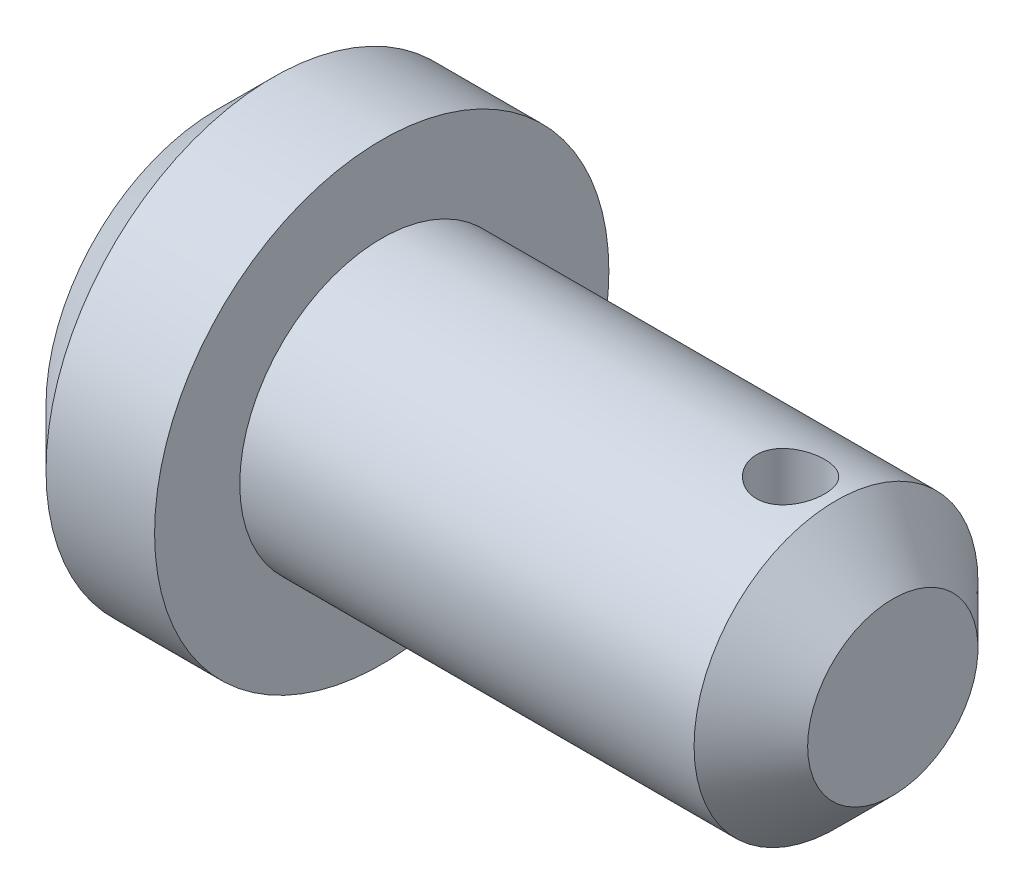
ISO-10303-21;
HEADER;
FILE_DESCRIPTION(('STEP AP214'),'2;1');
FILE_NAME('part.step','',(''),(''),'','','');
FILE_SCHEMA(('AUTOMOTIVE_DESIGN { 1 0 10303 214 1 1 1 1 }'));
ENDSEC;
DATA;
#1=APPLICATION_CONTEXT('core data for automotive mechanical design processes');
#2=APPLICATION_PROTOCOL_DEFINITION('international standard','automotive_design',2000,#1);
#3=PRODUCT_CONTEXT('',#1,'mechanical');
#4=PRODUCT('Part','Part','',(#3));
#5=PRODUCT_RELATED_PRODUCT_CATEGORY('part','',(#4));
#6=PRODUCT_DEFINITION_FORMATION('','',#4);
#7=PRODUCT_DEFINITION_CONTEXT('part definition',#1,'design');
#8=PRODUCT_DEFINITION('design','',#6,#7);
#9=PRODUCT_DEFINITION_SHAPE('','',#8);
#10=(LENGTH_UNIT() NAMED_UNIT(*) SI_UNIT(.MILLI.,.METRE.));
#11=(NAMED_UNIT(*) PLANE_ANGLE_UNIT() SI_UNIT($,.RADIAN.));
#12=(NAMED_UNIT(*) SI_UNIT($,.STERADIAN.) SOLID_ANGLE_UNIT());
#13=UNCERTAINTY_MEASURE_WITH_UNIT(LENGTH_MEASURE(1.E-05),#10,'distance_accuracy_value','');
#14=(GEOMETRIC_REPRESENTATION_CONTEXT(3) GLOBAL_UNCERTAINTY_ASSIGNED_CONTEXT((#13)) GLOBAL_UNIT_ASSIGNED_CONTEXT((#10,
#11,#12)) REPRESENTATION_CONTEXT('',''));
#15=CARTESIAN_POINT('',(0.,0.,0.));
#16=DIRECTION('',(0.,0.,1.));
#17=DIRECTION('',(1.,0.,0.));
#18=AXIS2_PLACEMENT_3D('',#15,#16,#17);
#19=CARTESIAN_POINT('',(90.,0.,-15.));
#20=DIRECTION('',(-1.,0.,0.));
#21=DIRECTION('',(0.,0.,1.));
#22=AXIS2_PLACEMENT_3D('',#19,#20,#21);
#23=PLANE('',#22);
#24=CARTESIAN_POINT('',(90.,0.,0.));
#25=DIRECTION('',(-1.,0.,0.));
#26=DIRECTION('',(0.,0.,1.));
#27=AXIS2_PLACEMENT_3D('',#24,#25,#26);
#28=CIRCLE('',#27,15.);
#29=CARTESIAN_POINT('',(90.,0.,15.));
#30=VERTEX_POINT('',#29);
#31=EDGE_CURVE('E10',#30,#30,#28,.T.);
#32=ORIENTED_EDGE('',*,*,#31,.F.);
#33=EDGE_LOOP('',(#32));
#34=FACE_BOUND('',#33,.T.);
#35=ADVANCED_FACE('F31',(#34),#23,.F.);
#36=CARTESIAN_POINT('',(90.,0.,0.));
#37=DIRECTION('',(-1.,0.,0.));
#38=DIRECTION('',(0.,0.,1.));
#39=AXIS2_PLACEMENT_3D('',#36,#37,#38);
#40=CONICAL_SURFACE('',#39,15.,0.78539816339745);
#41=CARTESIAN_POINT('',(80.,0.,0.));
#42=DIRECTION('',(-1.,0.,0.));
#43=DIRECTION('',(0.,0.,1.));
#44=AXIS2_PLACEMENT_3D('',#41,#42,#43);
#45=CIRCLE('',#44,25.);
#46=CARTESIAN_POINT('',(80.,0.,25.));
#47=VERTEX_POINT('',#46);
#48=EDGE_CURVE('E43',#47,#47,#45,.T.);
#49=ORIENTED_EDGE('',*,*,#48,.F.);
#50=EDGE_LOOP('',(#49));
#51=FACE_BOUND('',#50,.T.);
#52=ORIENTED_EDGE('',*,*,#31,.T.);
#53=EDGE_LOOP('',(#52));
#54=FACE_BOUND('',#53,.T.);
#55=ADVANCED_FACE('F82',(#51,#54),#40,.T.);
#56=CARTESIAN_POINT('',(0.,0.,0.));
#57=DIRECTION('',(-1.,0.,0.));
#58=DIRECTION('',(0.,0.,1.));
#59=AXIS2_PLACEMENT_3D('',#56,#57,#58);
#60=CYLINDRICAL_SURFACE('',#59,25.);
#61=CARTESIAN_POINT('',(72.,-24.2693221990232,6.));
#62=CARTESIAN_POINT('',(72.1659402675794,-24.2693192173439,6.00000460058749));
#63=CARTESIAN_POINT('',(72.3318290721376,-24.2710270328907,5.99311472313627));
#64=CARTESIAN_POINT('',(72.6624452022316,-24.2777997433194,5.96562344868169));
#65=CARTESIAN_POINT('',(72.8271723780411,-24.2828650632483,5.94502031563237));
#66=CARTESIAN_POINT('',(73.1542790051947,-24.2962060432289,5.89025958920488));
#67=CARTESIAN_POINT('',(73.316657577368,-24.304482874777,5.85609704951731));
#68=CARTESIAN_POINT('',(73.6379223232941,-24.324002012079,5.77448580831014));
#69=CARTESIAN_POINT('',(73.796807183095,-24.3352454135442,5.72703219729494));
#70=CARTESIAN_POINT('',(74.1096655326971,-24.3603450339749,5.61930954739399));
#71=CARTESIAN_POINT('',(74.2636465617872,-24.3741969907612,5.55906139358703));
#72=CARTESIAN_POINT('',(74.5659889469169,-24.4041320001377,5.42613868912028));
#73=CARTESIAN_POINT('',(74.7143482023366,-24.420215876438,5.35345954837853));
#74=CARTESIAN_POINT('',(75.0043616384202,-24.4541500249133,5.19624934621714));
#75=CARTESIAN_POINT('',(75.1460183038256,-24.471999634801,5.11172272360157));
#76=CARTESIAN_POINT('',(75.4218305512816,-24.5089827826595,4.93135257338601));
#77=CARTESIAN_POINT('',(75.5559832886854,-24.5281168015673,4.83550479634857));
#78=CARTESIAN_POINT('',(75.8182127702231,-24.5674915774464,4.63134479435269));
#79=CARTESIAN_POINT('',(75.9461375713543,-24.5877460219987,4.52284000132128));
#80=CARTESIAN_POINT('',(76.1924845495933,-24.628482704143,4.29548353417837));
#81=CARTESIAN_POINT('',(76.3109031828471,-24.6489650234755,4.17662803548193));
#82=CARTESIAN_POINT('',(76.5373706853919,-24.6895792444555,3.92942214664513));
#83=CARTESIAN_POINT('',(76.6454224129325,-24.7097112414296,3.80107439098764));
#84=CARTESIAN_POINT('',(76.8504987649067,-24.749084932891,3.53564701496837));
#85=CARTESIAN_POINT('',(76.9475193125169,-24.7683262966769,3.39856419538247));
#86=CARTESIAN_POINT('',(77.1309444483899,-24.805612728147,3.11485061597086));
#87=CARTESIAN_POINT('',(77.2172017224265,-24.8236399057151,2.96812218206264));
#88=CARTESIAN_POINT('',(77.3770534092945,-24.8577272433076,2.66763492888514));
#89=CARTESIAN_POINT('',(77.4506430427153,-24.8737866602543,2.51387348368351));
#90=CARTESIAN_POINT('',(77.5845132661768,-24.9034639147108,2.20050084057474));
#91=CARTESIAN_POINT('',(77.6448001969236,-24.917082914856,2.04089247207775));
#92=CARTESIAN_POINT('',(77.7516350608195,-24.9415044760467,1.71693448898555));
#93=CARTESIAN_POINT('',(77.7981780488381,-24.9523060231976,1.55258319115472));
#94=CARTESIAN_POINT('',(77.9150088400539,-24.9796180760798,1.0604267514532));
#95=CARTESIAN_POINT('',(77.9651756534708,-24.9916494382249,0.727223064781637));
#96=CARTESIAN_POINT('',(77.9981401776681,-24.9995546719704,0.225051972672738));
#97=CARTESIAN_POINT('',(78.0020739538704,-25.0004978214515,0.0572008556931632));
#98=CARTESIAN_POINT('',(77.9958899633766,-24.9990135577545,-0.278247999700323));
#99=CARTESIAN_POINT('',(77.985772022785,-24.9965861028638,-0.445845734952838));
#100=CARTESIAN_POINT('',(77.9350742745267,-24.9844710986104,-0.939451198306504));
#101=CARTESIAN_POINT('',(77.8746062809109,-24.9700581884779,-1.26352376365918));
#102=CARTESIAN_POINT('',(77.7018160748034,-24.9299774285752,-1.89661000878181));
#103=CARTESIAN_POINT('',(77.5894912289321,-24.9043090072343,-2.20562292291579));
#104=CARTESIAN_POINT('',(77.3152264563924,-24.8441871252282,-2.80308340285014));
#105=CARTESIAN_POINT('',(77.1528735211547,-24.8096609520016,-3.09133416391588));
#106=CARTESIAN_POINT('',(76.7834730999706,-24.7355808399422,-3.63689114777195));
#107=CARTESIAN_POINT('',(76.576418389583,-24.6960260888452,-3.89419235819688));
#108=CARTESIAN_POINT('',(76.1173692069228,-24.6150468786432,-4.37733250714646));
#109=CARTESIAN_POINT('',(75.8643812701335,-24.5736003966327,-4.60222487048295));
#110=CARTESIAN_POINT('',(75.3238487252116,-24.4944202534268,-5.00659136952867));
#111=CARTESIAN_POINT('',(75.0363027514,-24.4566867390692,-5.18606370943939));
#112=CARTESIAN_POINT('',(74.4330694882633,-24.3891322466935,-5.4950396533725));
#113=CARTESIAN_POINT('',(74.1172698985342,-24.3593449045093,-5.62433186444417));
#114=CARTESIAN_POINT('',(73.4675337525729,-24.3114966451333,-5.82770650444349));
#115=CARTESIAN_POINT('',(73.1336007491024,-24.2934334398264,-5.90179970658058));
#116=CARTESIAN_POINT('',(72.4658132413671,-24.2715545321338,-5.99113700492853));
#117=CARTESIAN_POINT('',(72.1321558604479,-24.2674017566251,-6.00777368474904));
#118=CARTESIAN_POINT('',(71.4668336063813,-24.2728991225919,-5.98552405004056));
#119=CARTESIAN_POINT('',(71.1351685680199,-24.2825481032417,-5.9466424049974));
#120=CARTESIAN_POINT('',(70.4883081855493,-24.3142403018893,-5.81567711192227));
#121=CARTESIAN_POINT('',(70.1729417225481,-24.3360979424441,-5.72438949541309));
#122=CARTESIAN_POINT('',(69.5619842842756,-24.3895714349639,-5.49207803402932));
#123=CARTESIAN_POINT('',(69.2663955116254,-24.4211883716179,-5.35104866039818));
#124=CARTESIAN_POINT('',(68.6974427781538,-24.491337816706,-5.0202958832683));
#125=CARTESIAN_POINT('',(68.4245823154112,-24.529985907154,-4.82973151657672));
#126=CARTESIAN_POINT('',(67.9141974686284,-24.609553113729,-4.40637723136316));
#127=CARTESIAN_POINT('',(67.6766784260197,-24.6504725718652,-4.17358094176829));
#128=CARTESIAN_POINT('',(67.2381740435764,-24.7311017019711,-3.66607172916322));
#129=CARTESIAN_POINT('',(67.0381478121625,-24.770762345906,-3.39052236174369));
#130=CARTESIAN_POINT('',(66.6871677504673,-24.8434406642277,-2.80874047615625));
#131=CARTESIAN_POINT('',(66.5362114256,-24.8764586762761,-2.50250951879601));
#132=CARTESIAN_POINT('',(66.3506355476032,-24.9181020803638,-2.02815096730082));
#133=CARTESIAN_POINT('',(66.2956917559489,-24.9306431435962,-1.86803584664664));
#134=CARTESIAN_POINT('',(66.1994846335862,-24.9528307363167,-1.54356696295539));
#135=CARTESIAN_POINT('',(66.1582161740162,-24.9624783508485,-1.3792148139756));
#136=CARTESIAN_POINT('',(66.0897096887009,-24.9785993962541,-1.04746058126015));
#137=CARTESIAN_POINT('',(66.0624723719879,-24.9850726667188,-0.880058343837639));
#138=CARTESIAN_POINT('',(66.0222598144282,-24.994659296045,-0.543455945222831));
#139=CARTESIAN_POINT('',(66.0092839612402,-24.997772799164,-0.374255861539253));
#140=CARTESIAN_POINT('',(65.9978529891506,-25.0005148115007,-0.0395721662635998));
#141=CARTESIAN_POINT('',(65.9990434297774,-25.0002283873103,0.12589876690648));
#142=CARTESIAN_POINT('',(66.0150800992914,-24.9963838456846,0.456136647513659));
#143=CARTESIAN_POINT('',(66.0299260318547,-24.9928257992435,0.620903610148956));
#144=CARTESIAN_POINT('',(66.0731527400705,-24.9825354772041,0.948575696498029));
#145=CARTESIAN_POINT('',(66.1015355520261,-24.9758027240481,1.11148053632313));
#146=CARTESIAN_POINT('',(66.1715911898645,-24.9593507893913,1.434191004048));
#147=CARTESIAN_POINT('',(66.2132593039809,-24.9496326667265,1.59399770944887));
#148=CARTESIAN_POINT('',(66.309349246711,-24.9275215666658,1.90878490028135));
#149=CARTESIAN_POINT('',(66.3637156829956,-24.9151402247434,2.06378312590839));
#150=CARTESIAN_POINT('',(66.4848611471134,-24.8880146824749,2.36857079597771));
#151=CARTESIAN_POINT('',(66.5516358370964,-24.8732713081285,2.51836203909183));
#152=CARTESIAN_POINT('',(66.6971524327788,-24.841802398867,2.81187682420641));
#153=CARTESIAN_POINT('',(66.7758995375637,-24.8250760035128,2.95559769529925));
#154=CARTESIAN_POINT('',(66.9447566902079,-24.7900921246488,3.23593617076046));
#155=CARTESIAN_POINT('',(67.0348629565684,-24.7718351513474,3.37255611776949));
#156=CARTESIAN_POINT('',(67.228022577442,-24.7338351675459,3.64090348698623));
#157=CARTESIAN_POINT('',(67.3313235133422,-24.7140678232284,3.77244930795078));
#158=CARTESIAN_POINT('',(67.5484552306476,-24.67397157657,4.02636882328125));
#159=CARTESIAN_POINT('',(67.6622823938778,-24.6536428688592,4.14874564331391));
#160=CARTESIAN_POINT('',(67.8998153905987,-24.6129603609015,4.38365180469934));
#161=CARTESIAN_POINT('',(68.0235271315938,-24.5926065529161,4.49617517167719));
#162=CARTESIAN_POINT('',(68.2799146383274,-24.5524543239015,4.71050671781096));
#163=CARTESIAN_POINT('',(68.4125871297228,-24.532655703704,4.81231877656934));
#164=CARTESIAN_POINT('',(68.6884373735082,-24.4938254842292,5.00624248933444));
#165=CARTESIAN_POINT('',(68.8317568635018,-24.474813007441,5.09815651544129));
#166=CARTESIAN_POINT('',(69.1257943083088,-24.4384897622653,5.26952462166943));
#167=CARTESIAN_POINT('',(69.2765095144213,-24.4211783687266,5.34898328559685));
#168=CARTESIAN_POINT('',(69.5842827159965,-24.3887740639133,5.49484184745972));
#169=CARTESIAN_POINT('',(69.7413376350791,-24.3736800927344,5.56124798952492));
#170=CARTESIAN_POINT('',(70.0606844821312,-24.3461620490208,5.6805037284954));
#171=CARTESIAN_POINT('',(70.2229755591399,-24.3337375451432,5.7333555158345));
#172=CARTESIAN_POINT('',(70.6490555972446,-24.3054947105591,5.85223691155717));
#173=CARTESIAN_POINT('',(70.9160735920256,-24.2920191452792,5.90755575023753));
#174=CARTESIAN_POINT('',(71.4554408076726,-24.2739356520306,5.98143220718613));
#175=CARTESIAN_POINT('',(71.7277896460575,-24.2693270902047,5.99999245314254));
#176=CARTESIAN_POINT('',(72.,-24.2693221990232,6.));
#177=B_SPLINE_CURVE_WITH_KNOTS('',3,(#61,#62,#63,#64,#65,#66,#67,#68,#69,#70,#71,#72,#73,#74,
#75,#76,#77,#78,#79,#80,#81,#82,#83,#84,#85,#86,#87,#88,#89,#90,#91,#92,#93,#94,#95,#96,#97,#98,
#99,#100,#101,#102,#103,#104,#105,#106,#107,#108,#109,#110,#111,#112,#113,#114,#115,#116,#117,
#118,#119,#120,#121,#122,#123,#124,#125,#126,#127,#128,#129,#130,#131,#132,#133,#134,#135,#136,
#137,#138,#139,#140,#141,#142,#143,#144,#145,#146,#147,#148,#149,#150,#151,#152,#153,#154,#155,
#156,#157,#158,#159,#160,#161,#162,#163,#164,#165,#166,#167,#168,#169,#170,#171,#172,#173,#174,
#175,#176),.UNSPECIFIED.,.T.,.F.,(4,2,2,2,2,2,2,2,2,2,2,2,2,2,2,2,2,2,2,2,2,2,2,2,2,2,2,2,2,2,2,
2,2,2,2,2,2,2,2,2,2,2,2,2,2,2,2,2,2,2,2,2,2,2,2,2,2,4),(0.,0.49758059138039,0.995224186553656,
1.4930494832496,1.99105891120689,2.48826158123245,2.98564823885731,3.48284904015122,
3.98023706425766,4.48653742340698,4.99302566076187,5.4993738510141,6.00590856964271,
6.51875380835026,7.03179211782625,7.54458535785561,8.05756287894231,9.06317072582739,
9.56637068685642,10.0695768752428,11.0544731736286,12.0394194922331,13.0327253814724,
14.0261919233719,15.0444773123883,16.0628029556732,17.0853730875996,18.1077435918426,
19.1051538629732,20.10248024975,21.0850439079104,22.0677168116698,23.0683069952269,
24.0690482527067,25.0926627677996,26.1162252368616,26.624940138715,27.1334640332021,
27.6420136222755,28.1505413750131,28.6463730888496,29.1421940434048,29.6380896060201,
30.1338094895389,30.6274060608767,31.1208303973834,31.6144696213306,32.1079449431357,
32.6126284711584,33.1171391648262,33.6219536669565,34.1265846927703,34.6399206216221,
35.1530671874622,35.6659676710412,36.1787852157025,36.9950805869967,37.8113176033062),.UNSPECIFIED.);
#178=CARTESIAN_POINT('',(72.,-24.2693221990232,6.));
#179=VERTEX_POINT('',#178);
#180=EDGE_CURVE('E34',#179,#179,#177,.T.);
#181=ORIENTED_EDGE('',*,*,#180,.T.);
#182=EDGE_LOOP('',(#181));
#183=FACE_BOUND('',#182,.T.);
#184=CARTESIAN_POINT('',(72.,24.2693221990232,6.));
#185=CARTESIAN_POINT('',(71.8340597324206,24.2693192173439,6.00000460058749));
#186=CARTESIAN_POINT('',(71.6681709278624,24.2710270328907,5.99311472313627));
#187=CARTESIAN_POINT('',(71.3375547977683,24.2777997433194,5.96562344868169));
#188=CARTESIAN_POINT('',(71.1728276219589,24.2828650632483,5.94502031563237));
#189=CARTESIAN_POINT('',(70.8457209948053,24.2962060432289,5.89025958920488));
#190=CARTESIAN_POINT('',(70.683342422632,24.304482874777,5.85609704951731));
#191=CARTESIAN_POINT('',(70.3620776767058,24.324002012079,5.77448580831014));
#192=CARTESIAN_POINT('',(70.203192816905,24.3352454135442,5.72703219729494));
#193=CARTESIAN_POINT('',(69.8903344673029,24.3603450339749,5.61930954739399));
#194=CARTESIAN_POINT('',(69.7363534382128,24.3741969907612,5.55906139358703));
#195=CARTESIAN_POINT('',(69.4340110530831,24.4041320001377,5.42613868912028));
#196=CARTESIAN_POINT('',(69.2856517976634,24.420215876438,5.35345954837853));
#197=CARTESIAN_POINT('',(68.9956383615798,24.4541500249133,5.19624934621714));
#198=CARTESIAN_POINT('',(68.8539816961744,24.471999634801,5.11172272360157));
#199=CARTESIAN_POINT('',(68.5781694487184,24.5089827826595,4.93135257338601));
#200=CARTESIAN_POINT('',(68.4440167113146,24.5281168015673,4.83550479634857));
#201=CARTESIAN_POINT('',(68.1817872297769,24.5674915774464,4.63134479435269));
#202=CARTESIAN_POINT('',(68.0538624286457,24.5877460219987,4.52284000132128));
#203=CARTESIAN_POINT('',(67.8075154504067,24.628482704143,4.29548353417837));
#204=CARTESIAN_POINT('',(67.6890968171529,24.6489650234755,4.17662803548193));
#205=CARTESIAN_POINT('',(67.4626293146081,24.6895792444555,3.92942214664514));
#206=CARTESIAN_POINT('',(67.3545775870675,24.7097112414296,3.80107439098764));
#207=CARTESIAN_POINT('',(67.1495012350933,24.749084932891,3.53564701496838));
#208=CARTESIAN_POINT('',(67.0524806874831,24.7683262966769,3.39856419538247));
#209=CARTESIAN_POINT('',(66.86905555161,24.805612728147,3.11485061597086));
#210=CARTESIAN_POINT('',(66.7827982775735,24.8236399057151,2.96812218206264));
#211=CARTESIAN_POINT('',(66.6229465907055,24.8577272433076,2.66763492888514));
#212=CARTESIAN_POINT('',(66.5493569572847,24.8737866602543,2.51387348368351));
#213=CARTESIAN_POINT('',(66.4154867338232,24.9034639147108,2.20050084057474));
#214=CARTESIAN_POINT('',(66.3551998030764,24.917082914856,2.04089247207775));
#215=CARTESIAN_POINT('',(66.2483649391805,24.9415044760467,1.71693448898555));
#216=CARTESIAN_POINT('',(66.2018219511619,24.9523060231976,1.55258319115472));
#217=CARTESIAN_POINT('',(66.0849911599461,24.9796180760798,1.0604267514532));
#218=CARTESIAN_POINT('',(66.0348243465292,24.9916494382249,0.727223064781637));
#219=CARTESIAN_POINT('',(66.0018598223319,24.9995546719704,0.225051972672737));
#220=CARTESIAN_POINT('',(65.9979260461296,25.0004978214515,0.0572008556931626));
#221=CARTESIAN_POINT('',(66.0041100366233,24.9990135577545,-0.278247999700323));
#222=CARTESIAN_POINT('',(66.014227977215,24.9965861028638,-0.445845734952838));
#223=CARTESIAN_POINT('',(66.0649257254733,24.9844710986104,-0.939451198306504));
#224=CARTESIAN_POINT('',(66.1253937190891,24.9700581884779,-1.26352376365918));
#225=CARTESIAN_POINT('',(66.2981839251966,24.9299774285752,-1.89661000878181));
#226=CARTESIAN_POINT('',(66.4105087710679,24.9043090072343,-2.20562292291579));
#227=CARTESIAN_POINT('',(66.6847735436076,24.8441871252282,-2.80308340285013));
#228=CARTESIAN_POINT('',(66.8471264788453,24.8096609520016,-3.09133416391587));
#229=CARTESIAN_POINT('',(67.2165269000294,24.7355808399422,-3.63689114777194));
#230=CARTESIAN_POINT('',(67.423581610417,24.6960260888452,-3.89419235819687));
#231=CARTESIAN_POINT('',(67.8826307930772,24.6150468786432,-4.37733250714646));
#232=CARTESIAN_POINT('',(68.1356187298665,24.5736003966327,-4.60222487048295));
#233=CARTESIAN_POINT('',(68.6761512747884,24.4944202534268,-5.00659136952867));
#234=CARTESIAN_POINT('',(68.9636972486,24.4566867390692,-5.18606370943939));
#235=CARTESIAN_POINT('',(69.5669305117367,24.3891322466935,-5.4950396533725));
#236=CARTESIAN_POINT('',(69.8827301014658,24.3593449045093,-5.62433186444417));
#237=CARTESIAN_POINT('',(70.532466247427,24.3114966451333,-5.82770650444349));
#238=CARTESIAN_POINT('',(70.8663992508976,24.2934334398264,-5.90179970658058));
#239=CARTESIAN_POINT('',(71.5341867586329,24.2715545321338,-5.99113700492853));
#240=CARTESIAN_POINT('',(71.8678441395521,24.2674017566251,-6.00777368474904));
#241=CARTESIAN_POINT('',(72.5331663936186,24.2728991225919,-5.98552405004056));
#242=CARTESIAN_POINT('',(72.8648314319801,24.2825481032417,-5.9466424049974));
#243=CARTESIAN_POINT('',(73.5116918144507,24.3142403018893,-5.81567711192227));
#244=CARTESIAN_POINT('',(73.8270582774519,24.3360979424441,-5.72438949541309));
#245=CARTESIAN_POINT('',(74.4380157157244,24.3895714349639,-5.49207803402932));
#246=CARTESIAN_POINT('',(74.7336044883746,24.4211883716179,-5.35104866039818));
#247=CARTESIAN_POINT('',(75.3025572218462,24.491337816706,-5.0202958832683));
#248=CARTESIAN_POINT('',(75.5754176845888,24.529985907154,-4.82973151657672));
#249=CARTESIAN_POINT('',(76.0858025313716,24.609553113729,-4.40637723136316));
#250=CARTESIAN_POINT('',(76.3233215739803,24.6504725718652,-4.17358094176829));
#251=CARTESIAN_POINT('',(76.7618259564236,24.7311017019711,-3.66607172916322));
#252=CARTESIAN_POINT('',(76.9618521878375,24.770762345906,-3.39052236174369));
#253=CARTESIAN_POINT('',(77.3128322495327,24.8434406642277,-2.80874047615625));
#254=CARTESIAN_POINT('',(77.4637885744,24.8764586762761,-2.50250951879601));
#255=CARTESIAN_POINT('',(77.6493644523968,24.9181020803638,-2.02815096730082));
#256=CARTESIAN_POINT('',(77.7043082440511,24.9306431435962,-1.86803584664664));
#257=CARTESIAN_POINT('',(77.8005153664138,24.9528307363167,-1.54356696295539));
#258=CARTESIAN_POINT('',(77.8417838259838,24.9624783508485,-1.3792148139756));
#259=CARTESIAN_POINT('',(77.9102903112991,24.9785993962541,-1.04746058126015));
#260=CARTESIAN_POINT('',(77.9375276280121,24.9850726667188,-0.880058343837639));
#261=CARTESIAN_POINT('',(77.9777401855718,24.994659296045,-0.543455945222831));
#262=CARTESIAN_POINT('',(77.9907160387597,24.997772799164,-0.374255861539253));
#263=CARTESIAN_POINT('',(78.0021470108494,25.0005148115007,-0.0395721662635998));
#264=CARTESIAN_POINT('',(78.0009565702226,25.0002283873103,0.12589876690648));
#265=CARTESIAN_POINT('',(77.9849199007086,24.9963838456846,0.456136647513659));
#266=CARTESIAN_POINT('',(77.9700739681453,24.9928257992435,0.620903610148956));
#267=CARTESIAN_POINT('',(77.9268472599295,24.9825354772041,0.948575696498029));
#268=CARTESIAN_POINT('',(77.8984644479739,24.9758027240481,1.11148053632313));
#269=CARTESIAN_POINT('',(77.8284088101355,24.9593507893913,1.434191004048));
#270=CARTESIAN_POINT('',(77.7867406960191,24.9496326667265,1.59399770944887));
#271=CARTESIAN_POINT('',(77.690650753289,24.9275215666658,1.90878490028135));
#272=CARTESIAN_POINT('',(77.6362843170044,24.9151402247434,2.06378312590839));
#273=CARTESIAN_POINT('',(77.5151388528865,24.8880146824749,2.36857079597771));
#274=CARTESIAN_POINT('',(77.4483641629035,24.8732713081285,2.51836203909183));
#275=CARTESIAN_POINT('',(77.3028475672212,24.841802398867,2.81187682420641));
#276=CARTESIAN_POINT('',(77.2241004624363,24.8250760035128,2.95559769529925));
#277=CARTESIAN_POINT('',(77.0552433097921,24.7900921246488,3.23593617076046));
#278=CARTESIAN_POINT('',(76.9651370434316,24.7718351513474,3.37255611776949));
#279=CARTESIAN_POINT('',(76.771977422558,24.7338351675459,3.64090348698623));
#280=CARTESIAN_POINT('',(76.6686764866578,24.7140678232284,3.77244930795077));
#281=CARTESIAN_POINT('',(76.4515447693524,24.67397157657,4.02636882328124));
#282=CARTESIAN_POINT('',(76.3377176061222,24.6536428688592,4.14874564331391));
#283=CARTESIAN_POINT('',(76.1001846094013,24.6129603609015,4.38365180469934));
#284=CARTESIAN_POINT('',(75.9764728684062,24.5926065529161,4.49617517167719));
#285=CARTESIAN_POINT('',(75.7200853616725,24.5524543239015,4.71050671781097));
#286=CARTESIAN_POINT('',(75.5874128702772,24.532655703704,4.81231877656934));
#287=CARTESIAN_POINT('',(75.3115626264918,24.4938254842292,5.00624248933444));
#288=CARTESIAN_POINT('',(75.1682431364982,24.474813007441,5.09815651544129));
#289=CARTESIAN_POINT('',(74.8742056916912,24.4384897622653,5.26952462166944));
#290=CARTESIAN_POINT('',(74.7234904855787,24.4211783687266,5.34898328559686));
#291=CARTESIAN_POINT('',(74.4157172840035,24.3887740639133,5.49484184745972));
#292=CARTESIAN_POINT('',(74.2586623649209,24.3736800927344,5.56124798952492));
#293=CARTESIAN_POINT('',(73.9393155178688,24.3461620490208,5.6805037284954));
#294=CARTESIAN_POINT('',(73.7770244408601,24.3337375451432,5.7333555158345));
#295=CARTESIAN_POINT('',(73.3509444027554,24.3054947105591,5.85223691155717));
#296=CARTESIAN_POINT('',(73.0839264079744,24.2920191452792,5.90755575023753));
#297=CARTESIAN_POINT('',(72.5445591923274,24.2739356520306,5.98143220718613));
#298=CARTESIAN_POINT('',(72.2722103539425,24.2693270902047,5.99999245314254));
#299=CARTESIAN_POINT('',(72.,24.2693221990232,6.));
#300=B_SPLINE_CURVE_WITH_KNOTS('',3,(#184,#185,#186,#187,#188,#189,#190,#191,#192,#193,#194,
#195,#196,#197,#198,#199,#200,#201,#202,#203,#204,#205,#206,#207,#208,#209,#210,#211,#212,#213,
#214,#215,#216,#217,#218,#219,#220,#221,#222,#223,#224,#225,#226,#227,#228,#229,#230,#231,#232,
#233,#234,#235,#236,#237,#238,#239,#240,#241,#242,#243,#244,#245,#246,#247,#248,#249,#250,#251,
#252,#253,#254,#255,#256,#257,#258,#259,#260,#261,#262,#263,#264,#265,#266,#267,#268,#269,#270,
#271,#272,#273,#274,#275,#276,#277,#278,#279,#280,#281,#282,#283,#284,#285,#286,#287,#288,#289,
#290,#291,#292,#293,#294,#295,#296,#297,#298,#299),.UNSPECIFIED.,.T.,.F.,(4,2,2,2,2,2,2,2,2,2,2,
2,2,2,2,2,2,2,2,2,2,2,2,2,2,2,2,2,2,2,2,2,2,2,2,2,2,2,2,2,2,2,2,2,2,2,2,2,2,2,2,2,2,2,2,2,2,4),
(0.,0.49758059138039,0.995224186553656,1.4930494832496,1.99105891120689,2.48826158123245,
2.98564823885731,3.48284904015122,3.98023706425766,4.48653742340698,4.99302566076187,
5.4993738510141,6.00590856964271,6.51875380835027,7.03179211782625,7.54458535785561,
8.05756287894231,9.06317072582739,9.56637068685642,10.0695768752428,11.0544731736286,
12.0394194922331,13.0327253814724,14.0261919233719,15.0444773123883,16.0628029556731,
17.0853730875996,18.1077435918426,19.1051538629732,20.10248024975,21.0850439079104,
22.0677168116698,23.0683069952269,24.0690482527067,25.0926627677996,26.1162252368616,
26.624940138715,27.1334640332021,27.6420136222755,28.150541375013,28.6463730888496,
29.1421940434048,29.6380896060201,30.1338094895389,30.6274060608767,31.1208303973834,
31.6144696213306,32.1079449431356,32.6126284711584,33.1171391648262,33.6219536669565,
34.1265846927703,34.6399206216221,35.1530671874622,35.6659676710412,36.1787852157025,
36.9950805869967,37.8113176033062),.UNSPECIFIED.);
#301=CARTESIAN_POINT('',(72.,24.2693221990232,6.));
#302=VERTEX_POINT('',#301);
#303=EDGE_CURVE('E51',#302,#302,#300,.T.);
#304=ORIENTED_EDGE('',*,*,#303,.T.);
#305=EDGE_LOOP('',(#304));
#306=FACE_BOUND('',#305,.T.);
#307=CARTESIAN_POINT('',(0.,0.,0.));
#308=DIRECTION('',(-1.,0.,0.));
#309=DIRECTION('',(0.,0.,1.));
#310=AXIS2_PLACEMENT_3D('',#307,#308,#309);
#311=CIRCLE('',#310,25.);
#312=CARTESIAN_POINT('',(0.,0.,25.));
#313=VERTEX_POINT('',#312);
#314=EDGE_CURVE('E48',#313,#313,#311,.T.);
#315=ORIENTED_EDGE('',*,*,#314,.F.);
#316=EDGE_LOOP('',(#315));
#317=FACE_BOUND('',#316,.T.);
#318=ORIENTED_EDGE('',*,*,#48,.T.);
#319=EDGE_LOOP('',(#318));
#320=FACE_BOUND('',#319,.T.);
#321=ADVANCED_FACE('F56',(#183,#306,#317,#320),#60,.T.);
#322=CARTESIAN_POINT('',(0.,0.,-25.));
#323=DIRECTION('',(-1.,0.,0.));
#324=DIRECTION('',(0.,0.,1.));
#325=AXIS2_PLACEMENT_3D('',#322,#323,#324);
#326=PLANE('',#325);
#327=CARTESIAN_POINT('',(0.,0.,0.));
#328=DIRECTION('',(-1.,0.,0.));
#329=DIRECTION('',(0.,0.,1.));
#330=AXIS2_PLACEMENT_3D('',#327,#328,#329);
#331=CIRCLE('',#330,40.);
#332=CARTESIAN_POINT('',(0.,0.,40.));
#333=VERTEX_POINT('',#332);
#334=EDGE_CURVE('E139',#333,#333,#331,.T.);
#335=ORIENTED_EDGE('',*,*,#334,.F.);
#336=EDGE_LOOP('',(#335));
#337=FACE_BOUND('',#336,.T.);
#338=ORIENTED_EDGE('',*,*,#314,.T.);
#339=EDGE_LOOP('',(#338));
#340=FACE_BOUND('',#339,.T.);
#341=ADVANCED_FACE('F75',(#337,#340),#326,.F.);
#342=CARTESIAN_POINT('',(0.,0.,0.));
#343=DIRECTION('',(-1.,0.,0.));
#344=DIRECTION('',(0.,0.,1.));
#345=AXIS2_PLACEMENT_3D('',#342,#343,#344);
#346=CYLINDRICAL_SURFACE('',#345,40.);
#347=CARTESIAN_POINT('',(-19.1204930200911,0.,0.));
#348=DIRECTION('',(-1.,0.,0.));
#349=DIRECTION('',(0.,0.,1.));
#350=AXIS2_PLACEMENT_3D('',#347,#348,#349);
#351=CIRCLE('',#350,40.);
#352=CARTESIAN_POINT('',(-19.1204930200911,0.,40.));
#353=VERTEX_POINT('',#352);
#354=EDGE_CURVE('E143',#353,#353,#351,.T.);
#355=ORIENTED_EDGE('',*,*,#354,.F.);
#356=EDGE_LOOP('',(#355));
#357=FACE_BOUND('',#356,.T.);
#358=ORIENTED_EDGE('',*,*,#334,.T.);
#359=EDGE_LOOP('',(#358));
#360=FACE_BOUND('',#359,.T.);
#361=ADVANCED_FACE('F72',(#357,#360),#346,.T.);
#362=CARTESIAN_POINT('',(-19.1204930200911,0.,0.));
#363=DIRECTION('',(1.,0.,0.));
#364=DIRECTION('',(0.,0.,-1.));
#365=AXIS2_PLACEMENT_3D('',#362,#363,#364);
#366=CONICAL_SURFACE('',#365,40.,0.785398163397444);
#367=CARTESIAN_POINT('',(-29.1204930200912,0.,0.));
#368=DIRECTION('',(-1.,0.,0.));
#369=DIRECTION('',(0.,0.,1.));
#370=AXIS2_PLACEMENT_3D('',#367,#368,#369);
#371=CIRCLE('',#370,30.);
#372=CARTESIAN_POINT('',(-29.1204930200912,0.,30.));
#373=VERTEX_POINT('',#372);
#374=EDGE_CURVE('E148',#373,#373,#371,.T.);
#375=ORIENTED_EDGE('',*,*,#374,.F.);
#376=EDGE_LOOP('',(#375));
#377=FACE_BOUND('',#376,.T.);
#378=ORIENTED_EDGE('',*,*,#354,.T.);
#379=EDGE_LOOP('',(#378));
#380=FACE_BOUND('',#379,.T.);
#381=ADVANCED_FACE('F68',(#377,#380),#366,.T.);
#382=CARTESIAN_POINT('',(-29.1204930200912,0.,-30.));
#383=DIRECTION('',(1.,0.,0.));
#384=DIRECTION('',(0.,0.,-1.));
#385=AXIS2_PLACEMENT_3D('',#382,#383,#384);
#386=PLANE('',#385);
#387=ORIENTED_EDGE('',*,*,#374,.T.);
#388=EDGE_LOOP('',(#387));
#389=FACE_BOUND('',#388,.T.);
#390=ADVANCED_FACE('F63',(#389),#386,.F.);
#391=CARTESIAN_POINT('',(72.,-40.,0.));
#392=DIRECTION('',(0.,1.,0.));
#393=DIRECTION('',(0.,0.,1.));
#394=AXIS2_PLACEMENT_3D('',#391,#392,#393);
#395=CYLINDRICAL_SURFACE('',#394,6.);
#396=ORIENTED_EDGE('',*,*,#303,.F.);
#397=EDGE_LOOP('',(#396));
#398=FACE_BOUND('',#397,.T.);
#399=ORIENTED_EDGE('',*,*,#180,.F.);
#400=EDGE_LOOP('',(#399));
#401=FACE_BOUND('',#400,.T.);
#402=ADVANCED_FACE('F59',(#398,#401),#395,.F.);
#403=CLOSED_SHELL('',(#35,#55,#321,#341,#361,#381,#390,#402));
#404=MANIFOLD_SOLID_BREP('B2',#403);
#405=ADVANCED_BREP_SHAPE_REPRESENTATION('',(#18,#404),#14);
#406=SHAPE_DEFINITION_REPRESENTATION(#9,#405);
ENDSEC;
END-ISO-10303-21;
